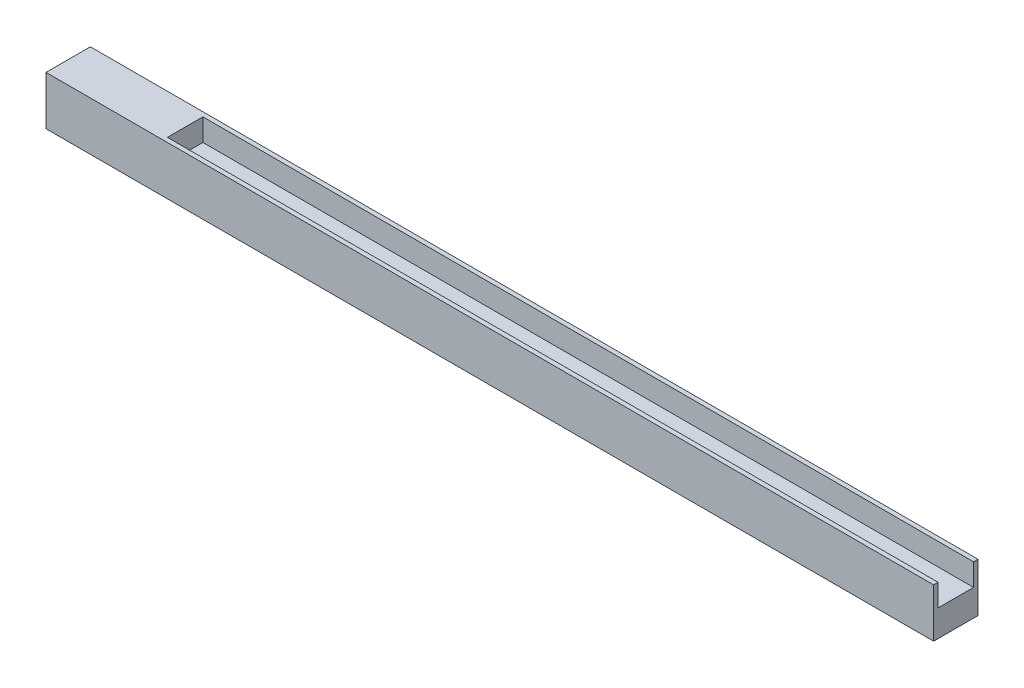
ISO-10303-21;
HEADER;
FILE_DESCRIPTION(('STEP AP214'),'2;1');
FILE_NAME('part.step','',(''),(''),'','','');
FILE_SCHEMA(('AUTOMOTIVE_DESIGN { 1 0 10303 214 1 1 1 1 }'));
ENDSEC;
DATA;
#1=APPLICATION_CONTEXT('core data for automotive mechanical design processes');
#2=APPLICATION_PROTOCOL_DEFINITION('international standard','automotive_design',2000,#1);
#3=PRODUCT_CONTEXT('',#1,'mechanical');
#4=PRODUCT('Part','Part','',(#3));
#5=PRODUCT_RELATED_PRODUCT_CATEGORY('part','',(#4));
#6=PRODUCT_DEFINITION_FORMATION('','',#4);
#7=PRODUCT_DEFINITION_CONTEXT('part definition',#1,'design');
#8=PRODUCT_DEFINITION('design','',#6,#7);
#9=PRODUCT_DEFINITION_SHAPE('','',#8);
#10=(LENGTH_UNIT() NAMED_UNIT(*) SI_UNIT(.MILLI.,.METRE.));
#11=(NAMED_UNIT(*) PLANE_ANGLE_UNIT() SI_UNIT($,.RADIAN.));
#12=(NAMED_UNIT(*) SI_UNIT($,.STERADIAN.) SOLID_ANGLE_UNIT());
#13=UNCERTAINTY_MEASURE_WITH_UNIT(LENGTH_MEASURE(1.E-05),#10,'distance_accuracy_value','');
#14=(GEOMETRIC_REPRESENTATION_CONTEXT(3) GLOBAL_UNCERTAINTY_ASSIGNED_CONTEXT((#13)) GLOBAL_UNIT_ASSIGNED_CONTEXT((#10,
#11,#12)) REPRESENTATION_CONTEXT('',''));
#15=CARTESIAN_POINT('',(0.,0.,0.));
#16=DIRECTION('',(0.,0.,1.));
#17=DIRECTION('',(1.,0.,0.));
#18=AXIS2_PLACEMENT_3D('',#15,#16,#17);
#19=CARTESIAN_POINT('',(0.,0.,12.7));
#20=DIRECTION('',(1.,0.,0.));
#21=DIRECTION('',(0.,1.,0.));
#22=AXIS2_PLACEMENT_3D('',#19,#20,#21);
#23=PLANE('',#22);
#24=DIRECTION('',(0.,-1.,0.));
#25=VECTOR('',#24,1.);
#26=CARTESIAN_POINT('',(0.,0.,0.));
#27=LINE('',#26,#25);
#28=CARTESIAN_POINT('',(0.,0.,0.));
#29=VERTEX_POINT('',#28);
#30=CARTESIAN_POINT('',(0.,-13.97,0.));
#31=VERTEX_POINT('',#30);
#32=EDGE_CURVE('E140',#29,#31,#27,.T.);
#33=ORIENTED_EDGE('',*,*,#32,.T.);
#34=DIRECTION('',(0.,0.,-1.));
#35=VECTOR('',#34,1.);
#36=CARTESIAN_POINT('',(0.,-13.97,12.7));
#37=LINE('',#36,#35);
#38=CARTESIAN_POINT('',(0.,-13.97,12.7));
#39=VERTEX_POINT('',#38);
#40=EDGE_CURVE('E11',#39,#31,#37,.T.);
#41=ORIENTED_EDGE('',*,*,#40,.F.);
#42=DIRECTION('',(0.,-1.,0.));
#43=VECTOR('',#42,1.);
#44=CARTESIAN_POINT('',(0.,0.,12.7));
#45=LINE('',#44,#43);
#46=CARTESIAN_POINT('',(0.,0.,12.7));
#47=VERTEX_POINT('',#46);
#48=EDGE_CURVE('E133',#47,#39,#45,.T.);
#49=ORIENTED_EDGE('',*,*,#48,.F.);
#50=DIRECTION('',(0.,0.,-1.));
#51=VECTOR('',#50,1.);
#52=CARTESIAN_POINT('',(0.,0.,12.7));
#53=LINE('',#52,#51);
#54=EDGE_CURVE('E139',#47,#29,#53,.T.);
#55=ORIENTED_EDGE('',*,*,#54,.T.);
#56=EDGE_LOOP('',(#33,#41,#49,#55));
#57=FACE_BOUND('',#56,.T.);
#58=ADVANCED_FACE('F33',(#57),#23,.F.);
#59=CARTESIAN_POINT('',(0.,-13.97,12.7));
#60=DIRECTION('',(0.,1.,0.));
#61=DIRECTION('',(-1.,0.,0.));
#62=AXIS2_PLACEMENT_3D('',#59,#60,#61);
#63=PLANE('',#62);
#64=DIRECTION('',(1.,0.,0.));
#65=VECTOR('',#64,1.);
#66=CARTESIAN_POINT('',(0.,-13.97,0.));
#67=LINE('',#66,#65);
#68=CARTESIAN_POINT('',(254.,-13.97,0.));
#69=VERTEX_POINT('',#68);
#70=EDGE_CURVE('E143',#31,#69,#67,.T.);
#71=ORIENTED_EDGE('',*,*,#70,.T.);
#72=DIRECTION('',(0.,0.,-1.));
#73=VECTOR('',#72,1.);
#74=CARTESIAN_POINT('',(254.,-13.97,12.7));
#75=LINE('',#74,#73);
#76=CARTESIAN_POINT('',(254.,-13.97,12.7));
#77=VERTEX_POINT('',#76);
#78=EDGE_CURVE('E40',#77,#69,#75,.T.);
#79=ORIENTED_EDGE('',*,*,#78,.F.);
#80=DIRECTION('',(1.,0.,0.));
#81=VECTOR('',#80,1.);
#82=CARTESIAN_POINT('',(0.,-13.97,12.7));
#83=LINE('',#82,#81);
#84=EDGE_CURVE('E83',#39,#77,#83,.T.);
#85=ORIENTED_EDGE('',*,*,#84,.F.);
#86=ORIENTED_EDGE('',*,*,#40,.T.);
#87=EDGE_LOOP('',(#71,#79,#85,#86));
#88=FACE_BOUND('',#87,.T.);
#89=ADVANCED_FACE('F186',(#88),#63,.F.);
#90=CARTESIAN_POINT('',(254.,0.,12.7));
#91=DIRECTION('',(-1.,0.,0.));
#92=DIRECTION('',(0.,0.,1.));
#93=AXIS2_PLACEMENT_3D('',#90,#91,#92);
#94=PLANE('',#93);
#95=DIRECTION('',(0.,0.,-1.));
#96=VECTOR('',#95,1.);
#97=CARTESIAN_POINT('',(254.,-6.35,1.27));
#98=LINE('',#97,#96);
#99=CARTESIAN_POINT('',(254.,-6.35,11.43));
#100=VERTEX_POINT('',#99);
#101=CARTESIAN_POINT('',(254.,-6.35,1.27));
#102=VERTEX_POINT('',#101);
#103=EDGE_CURVE('E112',#100,#102,#98,.T.);
#104=ORIENTED_EDGE('',*,*,#103,.F.);
#105=DIRECTION('',(0.,1.,0.));
#106=VECTOR('',#105,1.);
#107=CARTESIAN_POINT('',(254.,-6.35,11.43));
#108=LINE('',#107,#106);
#109=CARTESIAN_POINT('',(254.,0.,11.43));
#110=VERTEX_POINT('',#109);
#111=EDGE_CURVE('E144',#100,#110,#108,.T.);
#112=ORIENTED_EDGE('',*,*,#111,.T.);
#113=DIRECTION('',(0.,0.,-1.));
#114=VECTOR('',#113,1.);
#115=CARTESIAN_POINT('',(254.,0.,12.7));
#116=LINE('',#115,#114);
#117=CARTESIAN_POINT('',(254.,0.,12.7));
#118=VERTEX_POINT('',#117);
#119=EDGE_CURVE('E150',#118,#110,#116,.T.);
#120=ORIENTED_EDGE('',*,*,#119,.F.);
#121=DIRECTION('',(0.,1.,0.));
#122=VECTOR('',#121,1.);
#123=CARTESIAN_POINT('',(254.,0.,12.7));
#124=LINE('',#123,#122);
#125=EDGE_CURVE('E136',#77,#118,#124,.T.);
#126=ORIENTED_EDGE('',*,*,#125,.F.);
#127=ORIENTED_EDGE('',*,*,#78,.T.);
#128=DIRECTION('',(0.,1.,0.));
#129=VECTOR('',#128,1.);
#130=CARTESIAN_POINT('',(254.,0.,0.));
#131=LINE('',#130,#129);
#132=CARTESIAN_POINT('',(254.,0.,0.));
#133=VERTEX_POINT('',#132);
#134=EDGE_CURVE('E146',#69,#133,#131,.T.);
#135=ORIENTED_EDGE('',*,*,#134,.T.);
#136=CARTESIAN_POINT('',(254.,0.,1.27));
#137=VERTEX_POINT('',#136);
#138=EDGE_CURVE('E126',#137,#133,#116,.T.);
#139=ORIENTED_EDGE('',*,*,#138,.F.);
#140=DIRECTION('',(0.,1.,0.));
#141=VECTOR('',#140,1.);
#142=CARTESIAN_POINT('',(254.,-6.35,1.27));
#143=LINE('',#142,#141);
#144=EDGE_CURVE('E47',#102,#137,#143,.T.);
#145=ORIENTED_EDGE('',*,*,#144,.F.);
#146=EDGE_LOOP('',(#104,#112,#120,#126,#127,#135,#139,#145));
#147=FACE_BOUND('',#146,.T.);
#148=ADVANCED_FACE('F124',(#147),#94,.F.);
#149=CARTESIAN_POINT('',(0.,0.,12.7));
#150=DIRECTION('',(0.,-1.,0.));
#151=DIRECTION('',(0.,0.,-1.));
#152=AXIS2_PLACEMENT_3D('',#149,#150,#151);
#153=PLANE('',#152);
#154=ORIENTED_EDGE('',*,*,#119,.T.);
#155=DIRECTION('',(1.,0.,0.));
#156=VECTOR('',#155,1.);
#157=CARTESIAN_POINT('',(254.,0.,11.43));
#158=LINE('',#157,#156);
#159=CARTESIAN_POINT('',(33.4639231239514,0.,11.43));
#160=VERTEX_POINT('',#159);
#161=EDGE_CURVE('E121',#160,#110,#158,.T.);
#162=ORIENTED_EDGE('',*,*,#161,.F.);
#163=DIRECTION('',(0.,0.,1.));
#164=VECTOR('',#163,1.);
#165=CARTESIAN_POINT('',(33.4639231239514,0.,1.27000000000001));
#166=LINE('',#165,#164);
#167=CARTESIAN_POINT('',(33.4639231239514,0.,1.27000000000001));
#168=VERTEX_POINT('',#167);
#169=EDGE_CURVE('E169',#168,#160,#166,.T.);
#170=ORIENTED_EDGE('',*,*,#169,.F.);
#171=DIRECTION('',(-1.,0.,0.));
#172=VECTOR('',#171,1.);
#173=CARTESIAN_POINT('',(254.,0.,1.27));
#174=LINE('',#173,#172);
#175=EDGE_CURVE('E172',#137,#168,#174,.T.);
#176=ORIENTED_EDGE('',*,*,#175,.F.);
#177=ORIENTED_EDGE('',*,*,#138,.T.);
#178=DIRECTION('',(-1.,0.,0.));
#179=VECTOR('',#178,1.);
#180=CARTESIAN_POINT('',(0.,0.,0.));
#181=LINE('',#180,#179);
#182=EDGE_CURVE('E76',#133,#29,#181,.T.);
#183=ORIENTED_EDGE('',*,*,#182,.T.);
#184=ORIENTED_EDGE('',*,*,#54,.F.);
#185=DIRECTION('',(-1.,0.,0.));
#186=VECTOR('',#185,1.);
#187=CARTESIAN_POINT('',(0.,0.,12.7));
#188=LINE('',#187,#186);
#189=EDGE_CURVE('E56',#118,#47,#188,.T.);
#190=ORIENTED_EDGE('',*,*,#189,.F.);
#191=EDGE_LOOP('',(#154,#162,#170,#176,#177,#183,#184,#190));
#192=FACE_BOUND('',#191,.T.);
#193=ADVANCED_FACE('F162',(#192),#153,.F.);
#194=CARTESIAN_POINT('',(0.,0.,12.7));
#195=DIRECTION('',(0.,0.,1.));
#196=DIRECTION('',(1.,0.,0.));
#197=AXIS2_PLACEMENT_3D('',#194,#195,#196);
#198=PLANE('',#197);
#199=ORIENTED_EDGE('',*,*,#48,.T.);
#200=ORIENTED_EDGE('',*,*,#84,.T.);
#201=ORIENTED_EDGE('',*,*,#125,.T.);
#202=ORIENTED_EDGE('',*,*,#189,.T.);
#203=EDGE_LOOP('',(#199,#200,#201,#202));
#204=FACE_BOUND('',#203,.T.);
#205=ADVANCED_FACE('F197',(#204),#198,.T.);
#206=CARTESIAN_POINT('',(0.,0.,0.));
#207=DIRECTION('',(0.,0.,1.));
#208=DIRECTION('',(1.,0.,0.));
#209=AXIS2_PLACEMENT_3D('',#206,#207,#208);
#210=PLANE('',#209);
#211=ORIENTED_EDGE('',*,*,#32,.F.);
#212=ORIENTED_EDGE('',*,*,#182,.F.);
#213=ORIENTED_EDGE('',*,*,#134,.F.);
#214=ORIENTED_EDGE('',*,*,#70,.F.);
#215=EDGE_LOOP('',(#211,#212,#213,#214));
#216=FACE_BOUND('',#215,.T.);
#217=ADVANCED_FACE('F158',(#216),#210,.F.);
#218=CARTESIAN_POINT('',(254.,-6.35,11.43));
#219=DIRECTION('',(0.,0.,1.));
#220=DIRECTION('',(1.,0.,0.));
#221=AXIS2_PLACEMENT_3D('',#218,#219,#220);
#222=PLANE('',#221);
#223=ORIENTED_EDGE('',*,*,#161,.T.);
#224=ORIENTED_EDGE('',*,*,#111,.F.);
#225=DIRECTION('',(1.,0.,0.));
#226=VECTOR('',#225,1.);
#227=CARTESIAN_POINT('',(254.,-6.35,11.43));
#228=LINE('',#227,#226);
#229=CARTESIAN_POINT('',(33.4639231239514,-6.35,11.43));
#230=VERTEX_POINT('',#229);
#231=EDGE_CURVE('E118',#230,#100,#228,.T.);
#232=ORIENTED_EDGE('',*,*,#231,.F.);
#233=DIRECTION('',(0.,1.,0.));
#234=VECTOR('',#233,1.);
#235=CARTESIAN_POINT('',(33.4639231239514,-6.35,11.43));
#236=LINE('',#235,#234);
#237=EDGE_CURVE('E128',#230,#160,#236,.T.);
#238=ORIENTED_EDGE('',*,*,#237,.T.);
#239=EDGE_LOOP('',(#223,#224,#232,#238));
#240=FACE_BOUND('',#239,.T.);
#241=ADVANCED_FACE('F175',(#240),#222,.F.);
#242=CARTESIAN_POINT('',(33.4639231239514,-6.35,1.27000000000001));
#243=DIRECTION('',(-1.,0.,0.));
#244=DIRECTION('',(0.,0.,1.));
#245=AXIS2_PLACEMENT_3D('',#242,#243,#244);
#246=PLANE('',#245);
#247=ORIENTED_EDGE('',*,*,#169,.T.);
#248=ORIENTED_EDGE('',*,*,#237,.F.);
#249=DIRECTION('',(0.,0.,1.));
#250=VECTOR('',#249,1.);
#251=CARTESIAN_POINT('',(33.4639231239514,-6.35,1.27000000000001));
#252=LINE('',#251,#250);
#253=CARTESIAN_POINT('',(33.4639231239514,-6.35,1.27000000000001));
#254=VERTEX_POINT('',#253);
#255=EDGE_CURVE('E111',#254,#230,#252,.T.);
#256=ORIENTED_EDGE('',*,*,#255,.F.);
#257=DIRECTION('',(0.,1.,0.));
#258=VECTOR('',#257,1.);
#259=CARTESIAN_POINT('',(33.4639231239514,-6.35,1.27000000000001));
#260=LINE('',#259,#258);
#261=EDGE_CURVE('E107',#254,#168,#260,.T.);
#262=ORIENTED_EDGE('',*,*,#261,.T.);
#263=EDGE_LOOP('',(#247,#248,#256,#262));
#264=FACE_BOUND('',#263,.T.);
#265=ADVANCED_FACE('F176',(#264),#246,.F.);
#266=CARTESIAN_POINT('',(254.,-6.35,1.27));
#267=DIRECTION('',(0.,0.,-1.));
#268=DIRECTION('',(-1.,0.,0.));
#269=AXIS2_PLACEMENT_3D('',#266,#267,#268);
#270=PLANE('',#269);
#271=ORIENTED_EDGE('',*,*,#175,.T.);
#272=ORIENTED_EDGE('',*,*,#261,.F.);
#273=DIRECTION('',(-1.,0.,0.));
#274=VECTOR('',#273,1.);
#275=CARTESIAN_POINT('',(254.,-6.35,1.27));
#276=LINE('',#275,#274);
#277=EDGE_CURVE('E104',#102,#254,#276,.T.);
#278=ORIENTED_EDGE('',*,*,#277,.F.);
#279=ORIENTED_EDGE('',*,*,#144,.T.);
#280=EDGE_LOOP('',(#271,#272,#278,#279));
#281=FACE_BOUND('',#280,.T.);
#282=ADVANCED_FACE('F106',(#281),#270,.F.);
#283=CARTESIAN_POINT('',(0.,-6.35,0.));
#284=DIRECTION('',(0.,-1.,0.));
#285=DIRECTION('',(0.,0.,-1.));
#286=AXIS2_PLACEMENT_3D('',#283,#284,#285);
#287=PLANE('',#286);
#288=ORIENTED_EDGE('',*,*,#103,.T.);
#289=ORIENTED_EDGE('',*,*,#277,.T.);
#290=ORIENTED_EDGE('',*,*,#255,.T.);
#291=ORIENTED_EDGE('',*,*,#231,.T.);
#292=EDGE_LOOP('',(#288,#289,#290,#291));
#293=FACE_BOUND('',#292,.T.);
#294=ADVANCED_FACE('F116',(#293),#287,.F.);
#295=CLOSED_SHELL('',(#58,#89,#148,#193,#205,#217,#241,#265,#282,#294));
#296=MANIFOLD_SOLID_BREP('B2',#295);
#297=ADVANCED_BREP_SHAPE_REPRESENTATION('',(#18,#296),#14);
#298=SHAPE_DEFINITION_REPRESENTATION(#9,#297);
ENDSEC;
END-ISO-10303-21;
